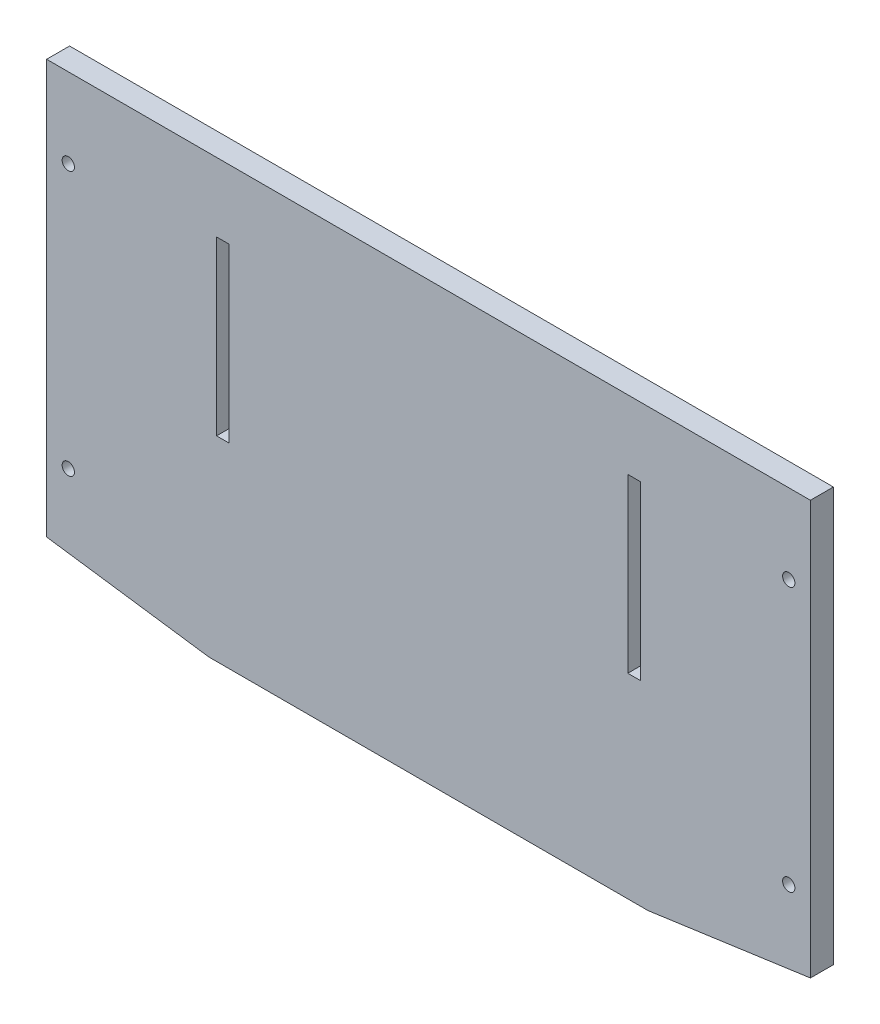
ISO-10303-21;
HEADER;
FILE_DESCRIPTION(('STEP AP214'),'2;1');
FILE_NAME('part.step','',(''),(''),'','','');
FILE_SCHEMA(('AUTOMOTIVE_DESIGN { 1 0 10303 214 1 1 1 1 }'));
ENDSEC;
DATA;
#1=APPLICATION_CONTEXT('core data for automotive mechanical design processes');
#2=APPLICATION_PROTOCOL_DEFINITION('international standard','automotive_design',2000,#1);
#3=PRODUCT_CONTEXT('',#1,'mechanical');
#4=PRODUCT('Part','Part','',(#3));
#5=PRODUCT_RELATED_PRODUCT_CATEGORY('part','',(#4));
#6=PRODUCT_DEFINITION_FORMATION('','',#4);
#7=PRODUCT_DEFINITION_CONTEXT('part definition',#1,'design');
#8=PRODUCT_DEFINITION('design','',#6,#7);
#9=PRODUCT_DEFINITION_SHAPE('','',#8);
#10=(LENGTH_UNIT() NAMED_UNIT(*) SI_UNIT(.MILLI.,.METRE.));
#11=(NAMED_UNIT(*) PLANE_ANGLE_UNIT() SI_UNIT($,.RADIAN.));
#12=(NAMED_UNIT(*) SI_UNIT($,.STERADIAN.) SOLID_ANGLE_UNIT());
#13=UNCERTAINTY_MEASURE_WITH_UNIT(LENGTH_MEASURE(1.E-05),#10,'distance_accuracy_value','');
#14=(GEOMETRIC_REPRESENTATION_CONTEXT(3) GLOBAL_UNCERTAINTY_ASSIGNED_CONTEXT((#13)) GLOBAL_UNIT_ASSIGNED_CONTEXT((#10,
#11,#12)) REPRESENTATION_CONTEXT('',''));
#15=CARTESIAN_POINT('',(0.,0.,0.));
#16=DIRECTION('',(0.,0.,1.));
#17=DIRECTION('',(1.,0.,0.));
#18=AXIS2_PLACEMENT_3D('',#15,#16,#17);
#19=CARTESIAN_POINT('',(0.,127.,6.35));
#20=DIRECTION('',(1.,0.,0.));
#21=DIRECTION('',(0.,1.,0.));
#22=AXIS2_PLACEMENT_3D('',#19,#20,#21);
#23=PLANE('',#22);
#24=DIRECTION('',(0.,-1.,0.));
#25=VECTOR('',#24,1.);
#26=CARTESIAN_POINT('',(0.,127.,0.));
#27=LINE('',#26,#25);
#28=CARTESIAN_POINT('',(0.,127.,0.));
#29=VERTEX_POINT('',#28);
#30=CARTESIAN_POINT('',(0.,12.6083117954881,0.));
#31=VERTEX_POINT('',#30);
#32=EDGE_CURVE('E297',#29,#31,#27,.T.);
#33=ORIENTED_EDGE('',*,*,#32,.T.);
#34=DIRECTION('',(0.,0.,1.));
#35=VECTOR('',#34,1.);
#36=CARTESIAN_POINT('',(0.,12.6083117954881,0.));
#37=LINE('',#36,#35);
#38=CARTESIAN_POINT('',(0.,12.6083117954881,6.35));
#39=VERTEX_POINT('',#38);
#40=EDGE_CURVE('E174',#31,#39,#37,.T.);
#41=ORIENTED_EDGE('',*,*,#40,.T.);
#42=DIRECTION('',(0.,-1.,0.));
#43=VECTOR('',#42,1.);
#44=CARTESIAN_POINT('',(0.,127.,6.35));
#45=LINE('',#44,#43);
#46=CARTESIAN_POINT('',(0.,127.,6.35));
#47=VERTEX_POINT('',#46);
#48=EDGE_CURVE('E298',#47,#39,#45,.T.);
#49=ORIENTED_EDGE('',*,*,#48,.F.);
#50=DIRECTION('',(0.,0.,-1.));
#51=VECTOR('',#50,1.);
#52=CARTESIAN_POINT('',(0.,127.,6.35));
#53=LINE('',#52,#51);
#54=EDGE_CURVE('E51',#47,#29,#53,.T.);
#55=ORIENTED_EDGE('',*,*,#54,.T.);
#56=EDGE_LOOP('',(#33,#41,#49,#55));
#57=FACE_BOUND('',#56,.T.);
#58=ADVANCED_FACE('F43',(#57),#23,.F.);
#59=CARTESIAN_POINT('',(211.1756,127.,6.35));
#60=DIRECTION('',(-1.,0.,0.));
#61=DIRECTION('',(0.,-1.,0.));
#62=AXIS2_PLACEMENT_3D('',#59,#60,#61);
#63=PLANE('',#62);
#64=DIRECTION('',(0.,1.,0.));
#65=VECTOR('',#64,1.);
#66=CARTESIAN_POINT('',(211.1756,127.,6.35));
#67=LINE('',#66,#65);
#68=CARTESIAN_POINT('',(211.1756,12.6083117954881,6.35));
#69=VERTEX_POINT('',#68);
#70=CARTESIAN_POINT('',(211.1756,127.,6.35));
#71=VERTEX_POINT('',#70);
#72=EDGE_CURVE('E302',#69,#71,#67,.T.);
#73=ORIENTED_EDGE('',*,*,#72,.F.);
#74=DIRECTION('',(0.,0.,1.));
#75=VECTOR('',#74,1.);
#76=CARTESIAN_POINT('',(211.1756,12.6083117954881,0.));
#77=LINE('',#76,#75);
#78=CARTESIAN_POINT('',(211.1756,12.6083117954881,0.));
#79=VERTEX_POINT('',#78);
#80=EDGE_CURVE('E166',#79,#69,#77,.T.);
#81=ORIENTED_EDGE('',*,*,#80,.F.);
#82=DIRECTION('',(0.,1.,0.));
#83=VECTOR('',#82,1.);
#84=CARTESIAN_POINT('',(211.1756,127.,0.));
#85=LINE('',#84,#83);
#86=CARTESIAN_POINT('',(211.1756,127.,0.));
#87=VERTEX_POINT('',#86);
#88=EDGE_CURVE('E164',#79,#87,#85,.T.);
#89=ORIENTED_EDGE('',*,*,#88,.T.);
#90=DIRECTION('',(0.,0.,-1.));
#91=VECTOR('',#90,1.);
#92=CARTESIAN_POINT('',(211.1756,127.,6.35));
#93=LINE('',#92,#91);
#94=EDGE_CURVE('E11',#71,#87,#93,.T.);
#95=ORIENTED_EDGE('',*,*,#94,.F.);
#96=EDGE_LOOP('',(#73,#81,#89,#95));
#97=FACE_BOUND('',#96,.T.);
#98=ADVANCED_FACE('F327',(#97),#63,.F.);
#99=CARTESIAN_POINT('',(211.1756,127.,6.35));
#100=DIRECTION('',(0.,-1.,0.));
#101=DIRECTION('',(1.,0.,0.));
#102=AXIS2_PLACEMENT_3D('',#99,#100,#101);
#103=PLANE('',#102);
#104=DIRECTION('',(-1.,0.,0.));
#105=VECTOR('',#104,1.);
#106=CARTESIAN_POINT('',(211.1756,127.,0.));
#107=LINE('',#106,#105);
#108=EDGE_CURVE('E303',#87,#29,#107,.T.);
#109=ORIENTED_EDGE('',*,*,#108,.T.);
#110=ORIENTED_EDGE('',*,*,#54,.F.);
#111=DIRECTION('',(-1.,0.,0.));
#112=VECTOR('',#111,1.);
#113=CARTESIAN_POINT('',(211.1756,127.,6.35));
#114=LINE('',#113,#112);
#115=EDGE_CURVE('E306',#71,#47,#114,.T.);
#116=ORIENTED_EDGE('',*,*,#115,.F.);
#117=ORIENTED_EDGE('',*,*,#94,.T.);
#118=EDGE_LOOP('',(#109,#110,#116,#117));
#119=FACE_BOUND('',#118,.T.);
#120=ADVANCED_FACE('F323',(#119),#103,.F.);
#121=CARTESIAN_POINT('',(0.,0.,6.35));
#122=DIRECTION('',(0.,0.,-1.));
#123=DIRECTION('',(-1.,0.,0.));
#124=AXIS2_PLACEMENT_3D('',#121,#122,#123);
#125=PLANE('',#124);
#126=DIRECTION('',(1.,0.,0.));
#127=VECTOR('',#126,1.);
#128=CARTESIAN_POINT('',(46.99,60.325,6.35));
#129=LINE('',#128,#127);
#130=CARTESIAN_POINT('',(46.99,60.325,6.35));
#131=VERTEX_POINT('',#130);
#132=CARTESIAN_POINT('',(50.4952,60.325,6.35));
#133=VERTEX_POINT('',#132);
#134=EDGE_CURVE('E198',#131,#133,#129,.T.);
#135=ORIENTED_EDGE('',*,*,#134,.F.);
#136=DIRECTION('',(0.,-1.,0.));
#137=VECTOR('',#136,1.);
#138=CARTESIAN_POINT('',(46.99,107.95,6.35));
#139=LINE('',#138,#137);
#140=CARTESIAN_POINT('',(46.99,107.95,6.35));
#141=VERTEX_POINT('',#140);
#142=EDGE_CURVE('E195',#141,#131,#139,.T.);
#143=ORIENTED_EDGE('',*,*,#142,.F.);
#144=DIRECTION('',(-1.,0.,0.));
#145=VECTOR('',#144,1.);
#146=CARTESIAN_POINT('',(46.99,107.95,6.35));
#147=LINE('',#146,#145);
#148=CARTESIAN_POINT('',(50.4952,107.95,6.35));
#149=VERTEX_POINT('',#148);
#150=EDGE_CURVE('E182',#149,#141,#147,.T.);
#151=ORIENTED_EDGE('',*,*,#150,.F.);
#152=DIRECTION('',(0.,1.,0.));
#153=VECTOR('',#152,1.);
#154=CARTESIAN_POINT('',(50.4952,107.95,6.35));
#155=LINE('',#154,#153);
#156=EDGE_CURVE('E203',#133,#149,#155,.T.);
#157=ORIENTED_EDGE('',*,*,#156,.F.);
#158=EDGE_LOOP('',(#135,#143,#151,#157));
#159=FACE_BOUND('',#158,.T.);
#160=DIRECTION('',(1.,0.,0.));
#161=VECTOR('',#160,1.);
#162=CARTESIAN_POINT('',(160.6804,60.325,6.35));
#163=LINE('',#162,#161);
#164=CARTESIAN_POINT('',(160.6804,60.325,6.35));
#165=VERTEX_POINT('',#164);
#166=CARTESIAN_POINT('',(164.1856,60.325,6.35));
#167=VERTEX_POINT('',#166);
#168=EDGE_CURVE('E244',#165,#167,#163,.T.);
#169=ORIENTED_EDGE('',*,*,#168,.F.);
#170=DIRECTION('',(0.,-1.,0.));
#171=VECTOR('',#170,1.);
#172=CARTESIAN_POINT('',(160.6804,107.95,6.35));
#173=LINE('',#172,#171);
#174=CARTESIAN_POINT('',(160.6804,107.95,6.35));
#175=VERTEX_POINT('',#174);
#176=EDGE_CURVE('E241',#175,#165,#173,.T.);
#177=ORIENTED_EDGE('',*,*,#176,.F.);
#178=DIRECTION('',(-1.,0.,0.));
#179=VECTOR('',#178,1.);
#180=CARTESIAN_POINT('',(160.6804,107.95,6.35));
#181=LINE('',#180,#179);
#182=CARTESIAN_POINT('',(164.1856,107.95,6.35));
#183=VERTEX_POINT('',#182);
#184=EDGE_CURVE('E228',#183,#175,#181,.T.);
#185=ORIENTED_EDGE('',*,*,#184,.F.);
#186=DIRECTION('',(0.,1.,0.));
#187=VECTOR('',#186,1.);
#188=CARTESIAN_POINT('',(164.1856,107.95,6.35));
#189=LINE('',#188,#187);
#190=EDGE_CURVE('E248',#167,#183,#189,.T.);
#191=ORIENTED_EDGE('',*,*,#190,.F.);
#192=EDGE_LOOP('',(#169,#177,#185,#191));
#193=FACE_BOUND('',#192,.T.);
#194=CARTESIAN_POINT('',(5.99440000000001,105.0036,6.35));
#195=DIRECTION('',(0.,0.,1.));
#196=DIRECTION('',(1.,0.,0.));
#197=AXIS2_PLACEMENT_3D('',#194,#195,#196);
#198=CIRCLE('',#197,1.7);
#199=CARTESIAN_POINT('',(7.69440000000001,105.0036,6.35));
#200=VERTEX_POINT('',#199);
#201=EDGE_CURVE('E213',#200,#200,#198,.T.);
#202=ORIENTED_EDGE('',*,*,#201,.F.);
#203=EDGE_LOOP('',(#202));
#204=FACE_BOUND('',#203,.T.);
#205=CARTESIAN_POINT('',(5.99440000000001,31.9786,6.35));
#206=DIRECTION('',(0.,0.,1.));
#207=DIRECTION('',(1.,0.,0.));
#208=AXIS2_PLACEMENT_3D('',#205,#206,#207);
#209=CIRCLE('',#208,1.7);
#210=CARTESIAN_POINT('',(7.69440000000001,31.9786,6.35));
#211=VERTEX_POINT('',#210);
#212=EDGE_CURVE('E273',#211,#211,#209,.T.);
#213=ORIENTED_EDGE('',*,*,#212,.F.);
#214=EDGE_LOOP('',(#213));
#215=FACE_BOUND('',#214,.T.);
#216=CARTESIAN_POINT('',(205.1812,31.9786,6.35));
#217=DIRECTION('',(0.,0.,1.));
#218=DIRECTION('',(1.,0.,0.));
#219=AXIS2_PLACEMENT_3D('',#216,#217,#218);
#220=CIRCLE('',#219,1.70000000000001);
#221=CARTESIAN_POINT('',(206.8812,31.9786,6.35));
#222=VERTEX_POINT('',#221);
#223=EDGE_CURVE('E281',#222,#222,#220,.T.);
#224=ORIENTED_EDGE('',*,*,#223,.F.);
#225=EDGE_LOOP('',(#224));
#226=FACE_BOUND('',#225,.T.);
#227=CARTESIAN_POINT('',(205.1812,105.0036,6.35));
#228=DIRECTION('',(0.,0.,1.));
#229=DIRECTION('',(1.,0.,0.));
#230=AXIS2_PLACEMENT_3D('',#227,#228,#229);
#231=CIRCLE('',#230,1.70000000000001);
#232=CARTESIAN_POINT('',(206.8812,105.0036,6.35));
#233=VERTEX_POINT('',#232);
#234=EDGE_CURVE('E289',#233,#233,#231,.T.);
#235=ORIENTED_EDGE('',*,*,#234,.F.);
#236=EDGE_LOOP('',(#235));
#237=FACE_BOUND('',#236,.T.);
#238=DIRECTION('',(-0.990268068741571,0.139173100960058,0.));
#239=VECTOR('',#238,1.);
#240=CARTESIAN_POINT('',(0.,12.6083117954881,6.35));
#241=LINE('',#240,#239);
#242=CARTESIAN_POINT('',(44.8563999999999,6.30415589774405,6.35));
#243=VERTEX_POINT('',#242);
#244=EDGE_CURVE('E170',#243,#39,#241,.T.);
#245=ORIENTED_EDGE('',*,*,#244,.F.);
#246=DIRECTION('',(-1.,0.,0.));
#247=VECTOR('',#246,1.);
#248=CARTESIAN_POINT('',(44.8563999999999,6.30415589774405,6.35));
#249=LINE('',#248,#247);
#250=CARTESIAN_POINT('',(166.3192,6.30415589774404,6.35));
#251=VERTEX_POINT('',#250);
#252=EDGE_CURVE('E58',#251,#243,#249,.T.);
#253=ORIENTED_EDGE('',*,*,#252,.F.);
#254=DIRECTION('',(-0.990268068741571,-0.139173100960059,0.));
#255=VECTOR('',#254,1.);
#256=CARTESIAN_POINT('',(211.1756,12.6083117954881,6.35));
#257=LINE('',#256,#255);
#258=EDGE_CURVE('E157',#69,#251,#257,.T.);
#259=ORIENTED_EDGE('',*,*,#258,.F.);
#260=ORIENTED_EDGE('',*,*,#72,.T.);
#261=ORIENTED_EDGE('',*,*,#115,.T.);
#262=ORIENTED_EDGE('',*,*,#48,.T.);
#263=EDGE_LOOP('',(#245,#253,#259,#260,#261,#262));
#264=FACE_BOUND('',#263,.T.);
#265=ADVANCED_FACE('F330',(#159,#193,#204,#215,#226,#237,#264),#125,.F.);
#266=CARTESIAN_POINT('',(0.,0.,0.));
#267=DIRECTION('',(0.,0.,-1.));
#268=DIRECTION('',(-1.,0.,0.));
#269=AXIS2_PLACEMENT_3D('',#266,#267,#268);
#270=PLANE('',#269);
#271=DIRECTION('',(-1.,0.,0.));
#272=VECTOR('',#271,1.);
#273=CARTESIAN_POINT('',(44.8563999999999,6.30415589774405,0.));
#274=LINE('',#273,#272);
#275=CARTESIAN_POINT('',(166.3192,6.30415589774404,0.));
#276=VERTEX_POINT('',#275);
#277=CARTESIAN_POINT('',(44.8563999999999,6.30415589774405,0.));
#278=VERTEX_POINT('',#277);
#279=EDGE_CURVE('E143',#276,#278,#274,.T.);
#280=ORIENTED_EDGE('',*,*,#279,.T.);
#281=DIRECTION('',(-0.990268068741571,0.139173100960058,0.));
#282=VECTOR('',#281,1.);
#283=CARTESIAN_POINT('',(0.,12.6083117954881,0.));
#284=LINE('',#283,#282);
#285=EDGE_CURVE('E66',#278,#31,#284,.T.);
#286=ORIENTED_EDGE('',*,*,#285,.T.);
#287=ORIENTED_EDGE('',*,*,#32,.F.);
#288=ORIENTED_EDGE('',*,*,#108,.F.);
#289=ORIENTED_EDGE('',*,*,#88,.F.);
#290=DIRECTION('',(-0.990268068741571,-0.139173100960059,0.));
#291=VECTOR('',#290,1.);
#292=CARTESIAN_POINT('',(211.1756,12.6083117954881,0.));
#293=LINE('',#292,#291);
#294=EDGE_CURVE('E154',#79,#276,#293,.T.);
#295=ORIENTED_EDGE('',*,*,#294,.T.);
#296=EDGE_LOOP('',(#280,#286,#287,#288,#289,#295));
#297=FACE_BOUND('',#296,.T.);
#298=DIRECTION('',(0.,-1.,0.));
#299=VECTOR('',#298,1.);
#300=CARTESIAN_POINT('',(46.99,107.95,0.));
#301=LINE('',#300,#299);
#302=CARTESIAN_POINT('',(46.99,107.95,0.));
#303=VERTEX_POINT('',#302);
#304=CARTESIAN_POINT('',(46.99,60.325,0.));
#305=VERTEX_POINT('',#304);
#306=EDGE_CURVE('E177',#303,#305,#301,.T.);
#307=ORIENTED_EDGE('',*,*,#306,.T.);
#308=DIRECTION('',(1.,0.,0.));
#309=VECTOR('',#308,1.);
#310=CARTESIAN_POINT('',(46.99,60.325,0.));
#311=LINE('',#310,#309);
#312=CARTESIAN_POINT('',(50.4952,60.325,0.));
#313=VERTEX_POINT('',#312);
#314=EDGE_CURVE('E181',#305,#313,#311,.T.);
#315=ORIENTED_EDGE('',*,*,#314,.T.);
#316=DIRECTION('',(0.,1.,0.));
#317=VECTOR('',#316,1.);
#318=CARTESIAN_POINT('',(50.4952,107.95,0.));
#319=LINE('',#318,#317);
#320=CARTESIAN_POINT('',(50.4952,107.95,0.));
#321=VERTEX_POINT('',#320);
#322=EDGE_CURVE('E186',#313,#321,#319,.T.);
#323=ORIENTED_EDGE('',*,*,#322,.T.);
#324=DIRECTION('',(-1.,0.,0.));
#325=VECTOR('',#324,1.);
#326=CARTESIAN_POINT('',(46.99,107.95,0.));
#327=LINE('',#326,#325);
#328=EDGE_CURVE('E190',#321,#303,#327,.T.);
#329=ORIENTED_EDGE('',*,*,#328,.T.);
#330=EDGE_LOOP('',(#307,#315,#323,#329));
#331=FACE_BOUND('',#330,.T.);
#332=DIRECTION('',(0.,-1.,0.));
#333=VECTOR('',#332,1.);
#334=CARTESIAN_POINT('',(160.6804,107.95,0.));
#335=LINE('',#334,#333);
#336=CARTESIAN_POINT('',(160.6804,107.95,0.));
#337=VERTEX_POINT('',#336);
#338=CARTESIAN_POINT('',(160.6804,60.325,0.));
#339=VERTEX_POINT('',#338);
#340=EDGE_CURVE('E223',#337,#339,#335,.T.);
#341=ORIENTED_EDGE('',*,*,#340,.T.);
#342=DIRECTION('',(1.,0.,0.));
#343=VECTOR('',#342,1.);
#344=CARTESIAN_POINT('',(160.6804,60.325,0.));
#345=LINE('',#344,#343);
#346=CARTESIAN_POINT('',(164.1856,60.325,0.));
#347=VERTEX_POINT('',#346);
#348=EDGE_CURVE('E227',#339,#347,#345,.T.);
#349=ORIENTED_EDGE('',*,*,#348,.T.);
#350=DIRECTION('',(0.,1.,0.));
#351=VECTOR('',#350,1.);
#352=CARTESIAN_POINT('',(164.1856,107.95,0.));
#353=LINE('',#352,#351);
#354=CARTESIAN_POINT('',(164.1856,107.95,0.));
#355=VERTEX_POINT('',#354);
#356=EDGE_CURVE('E232',#347,#355,#353,.T.);
#357=ORIENTED_EDGE('',*,*,#356,.T.);
#358=DIRECTION('',(-1.,0.,0.));
#359=VECTOR('',#358,1.);
#360=CARTESIAN_POINT('',(160.6804,107.95,0.));
#361=LINE('',#360,#359);
#362=EDGE_CURVE('E236',#355,#337,#361,.T.);
#363=ORIENTED_EDGE('',*,*,#362,.T.);
#364=EDGE_LOOP('',(#341,#349,#357,#363));
#365=FACE_BOUND('',#364,.T.);
#366=CARTESIAN_POINT('',(5.99440000000001,105.0036,0.));
#367=DIRECTION('',(0.,0.,1.));
#368=DIRECTION('',(1.,0.,0.));
#369=AXIS2_PLACEMENT_3D('',#366,#367,#368);
#370=CIRCLE('',#369,1.7);
#371=CARTESIAN_POINT('',(7.69440000000001,105.0036,0.));
#372=VERTEX_POINT('',#371);
#373=EDGE_CURVE('E269',#372,#372,#370,.T.);
#374=ORIENTED_EDGE('',*,*,#373,.T.);
#375=EDGE_LOOP('',(#374));
#376=FACE_BOUND('',#375,.T.);
#377=CARTESIAN_POINT('',(5.99440000000001,31.9786,0.));
#378=DIRECTION('',(0.,0.,1.));
#379=DIRECTION('',(1.,0.,0.));
#380=AXIS2_PLACEMENT_3D('',#377,#378,#379);
#381=CIRCLE('',#380,1.7);
#382=CARTESIAN_POINT('',(7.69440000000001,31.9786,0.));
#383=VERTEX_POINT('',#382);
#384=EDGE_CURVE('E277',#383,#383,#381,.T.);
#385=ORIENTED_EDGE('',*,*,#384,.T.);
#386=EDGE_LOOP('',(#385));
#387=FACE_BOUND('',#386,.T.);
#388=CARTESIAN_POINT('',(205.1812,31.9786,0.));
#389=DIRECTION('',(0.,0.,1.));
#390=DIRECTION('',(1.,0.,0.));
#391=AXIS2_PLACEMENT_3D('',#388,#389,#390);
#392=CIRCLE('',#391,1.70000000000001);
#393=CARTESIAN_POINT('',(206.8812,31.9786,0.));
#394=VERTEX_POINT('',#393);
#395=EDGE_CURVE('E285',#394,#394,#392,.T.);
#396=ORIENTED_EDGE('',*,*,#395,.T.);
#397=EDGE_LOOP('',(#396));
#398=FACE_BOUND('',#397,.T.);
#399=CARTESIAN_POINT('',(205.1812,105.0036,0.));
#400=DIRECTION('',(0.,0.,1.));
#401=DIRECTION('',(1.,0.,0.));
#402=AXIS2_PLACEMENT_3D('',#399,#400,#401);
#403=CIRCLE('',#402,1.70000000000001);
#404=CARTESIAN_POINT('',(206.8812,105.0036,0.));
#405=VERTEX_POINT('',#404);
#406=EDGE_CURVE('E293',#405,#405,#403,.T.);
#407=ORIENTED_EDGE('',*,*,#406,.T.);
#408=EDGE_LOOP('',(#407));
#409=FACE_BOUND('',#408,.T.);
#410=ADVANCED_FACE('F161',(#297,#331,#365,#376,#387,#398,#409),#270,.T.);
#411=CARTESIAN_POINT('',(205.1812,105.0036,6.35));
#412=DIRECTION('',(0.,0.,1.));
#413=DIRECTION('',(1.,0.,0.));
#414=AXIS2_PLACEMENT_3D('',#411,#412,#413);
#415=CYLINDRICAL_SURFACE('',#414,1.70000000000001);
#416=ORIENTED_EDGE('',*,*,#406,.F.);
#417=EDGE_LOOP('',(#416));
#418=FACE_BOUND('',#417,.T.);
#419=ORIENTED_EDGE('',*,*,#234,.T.);
#420=EDGE_LOOP('',(#419));
#421=FACE_BOUND('',#420,.T.);
#422=ADVANCED_FACE('F361',(#418,#421),#415,.F.);
#423=CARTESIAN_POINT('',(205.1812,31.9786,6.35));
#424=DIRECTION('',(0.,0.,1.));
#425=DIRECTION('',(1.,0.,0.));
#426=AXIS2_PLACEMENT_3D('',#423,#424,#425);
#427=CYLINDRICAL_SURFACE('',#426,1.70000000000001);
#428=ORIENTED_EDGE('',*,*,#395,.F.);
#429=EDGE_LOOP('',(#428));
#430=FACE_BOUND('',#429,.T.);
#431=ORIENTED_EDGE('',*,*,#223,.T.);
#432=EDGE_LOOP('',(#431));
#433=FACE_BOUND('',#432,.T.);
#434=ADVANCED_FACE('F367',(#430,#433),#427,.F.);
#435=CARTESIAN_POINT('',(5.99440000000001,31.9786,6.35));
#436=DIRECTION('',(0.,0.,1.));
#437=DIRECTION('',(1.,0.,0.));
#438=AXIS2_PLACEMENT_3D('',#435,#436,#437);
#439=CYLINDRICAL_SURFACE('',#438,1.7);
#440=ORIENTED_EDGE('',*,*,#384,.F.);
#441=EDGE_LOOP('',(#440));
#442=FACE_BOUND('',#441,.T.);
#443=ORIENTED_EDGE('',*,*,#212,.T.);
#444=EDGE_LOOP('',(#443));
#445=FACE_BOUND('',#444,.T.);
#446=ADVANCED_FACE('F371',(#442,#445),#439,.F.);
#447=CARTESIAN_POINT('',(5.99440000000001,105.0036,6.35));
#448=DIRECTION('',(0.,0.,1.));
#449=DIRECTION('',(1.,0.,0.));
#450=AXIS2_PLACEMENT_3D('',#447,#448,#449);
#451=CYLINDRICAL_SURFACE('',#450,1.7);
#452=ORIENTED_EDGE('',*,*,#373,.F.);
#453=EDGE_LOOP('',(#452));
#454=FACE_BOUND('',#453,.T.);
#455=ORIENTED_EDGE('',*,*,#201,.T.);
#456=EDGE_LOOP('',(#455));
#457=FACE_BOUND('',#456,.T.);
#458=ADVANCED_FACE('F375',(#454,#457),#451,.F.);
#459=CARTESIAN_POINT('',(160.6804,107.95,0.));
#460=DIRECTION('',(-1.,0.,0.));
#461=DIRECTION('',(0.,0.,1.));
#462=AXIS2_PLACEMENT_3D('',#459,#460,#461);
#463=PLANE('',#462);
#464=ORIENTED_EDGE('',*,*,#176,.T.);
#465=DIRECTION('',(0.,0.,1.));
#466=VECTOR('',#465,1.);
#467=CARTESIAN_POINT('',(160.6804,60.325,0.));
#468=LINE('',#467,#466);
#469=EDGE_CURVE('E240',#339,#165,#468,.T.);
#470=ORIENTED_EDGE('',*,*,#469,.F.);
#471=ORIENTED_EDGE('',*,*,#340,.F.);
#472=DIRECTION('',(0.,0.,1.));
#473=VECTOR('',#472,1.);
#474=CARTESIAN_POINT('',(160.6804,107.95,0.));
#475=LINE('',#474,#473);
#476=EDGE_CURVE('E199',#337,#175,#475,.T.);
#477=ORIENTED_EDGE('',*,*,#476,.T.);
#478=EDGE_LOOP('',(#464,#470,#471,#477));
#479=FACE_BOUND('',#478,.T.);
#480=ADVANCED_FACE('F379',(#479),#463,.F.);
#481=CARTESIAN_POINT('',(160.6804,107.95,0.));
#482=DIRECTION('',(0.,1.,0.));
#483=DIRECTION('',(-1.,0.,0.));
#484=AXIS2_PLACEMENT_3D('',#481,#482,#483);
#485=PLANE('',#484);
#486=ORIENTED_EDGE('',*,*,#184,.T.);
#487=ORIENTED_EDGE('',*,*,#476,.F.);
#488=ORIENTED_EDGE('',*,*,#362,.F.);
#489=DIRECTION('',(0.,0.,1.));
#490=VECTOR('',#489,1.);
#491=CARTESIAN_POINT('',(164.1856,107.95,0.));
#492=LINE('',#491,#490);
#493=EDGE_CURVE('E257',#355,#183,#492,.T.);
#494=ORIENTED_EDGE('',*,*,#493,.T.);
#495=EDGE_LOOP('',(#486,#487,#488,#494));
#496=FACE_BOUND('',#495,.T.);
#497=ADVANCED_FACE('F383',(#496),#485,.F.);
#498=CARTESIAN_POINT('',(164.1856,107.95,0.));
#499=DIRECTION('',(1.,0.,0.));
#500=DIRECTION('',(0.,1.,0.));
#501=AXIS2_PLACEMENT_3D('',#498,#499,#500);
#502=PLANE('',#501);
#503=ORIENTED_EDGE('',*,*,#190,.T.);
#504=ORIENTED_EDGE('',*,*,#493,.F.);
#505=ORIENTED_EDGE('',*,*,#356,.F.);
#506=DIRECTION('',(0.,0.,1.));
#507=VECTOR('',#506,1.);
#508=CARTESIAN_POINT('',(164.1856,60.325,0.));
#509=LINE('',#508,#507);
#510=EDGE_CURVE('E260',#347,#167,#509,.T.);
#511=ORIENTED_EDGE('',*,*,#510,.T.);
#512=EDGE_LOOP('',(#503,#504,#505,#511));
#513=FACE_BOUND('',#512,.T.);
#514=ADVANCED_FACE('F389',(#513),#502,.F.);
#515=CARTESIAN_POINT('',(160.6804,60.325,0.));
#516=DIRECTION('',(0.,-1.,0.));
#517=DIRECTION('',(0.,0.,-1.));
#518=AXIS2_PLACEMENT_3D('',#515,#516,#517);
#519=PLANE('',#518);
#520=ORIENTED_EDGE('',*,*,#168,.T.);
#521=ORIENTED_EDGE('',*,*,#510,.F.);
#522=ORIENTED_EDGE('',*,*,#348,.F.);
#523=ORIENTED_EDGE('',*,*,#469,.T.);
#524=EDGE_LOOP('',(#520,#521,#522,#523));
#525=FACE_BOUND('',#524,.T.);
#526=ADVANCED_FACE('F385',(#525),#519,.F.);
#527=CARTESIAN_POINT('',(46.99,107.95,0.));
#528=DIRECTION('',(-1.,0.,0.));
#529=DIRECTION('',(0.,-1.,0.));
#530=AXIS2_PLACEMENT_3D('',#527,#528,#529);
#531=PLANE('',#530);
#532=ORIENTED_EDGE('',*,*,#142,.T.);
#533=DIRECTION('',(0.,0.,1.));
#534=VECTOR('',#533,1.);
#535=CARTESIAN_POINT('',(46.99,60.325,0.));
#536=LINE('',#535,#534);
#537=EDGE_CURVE('E194',#305,#131,#536,.T.);
#538=ORIENTED_EDGE('',*,*,#537,.F.);
#539=ORIENTED_EDGE('',*,*,#306,.F.);
#540=DIRECTION('',(0.,0.,1.));
#541=VECTOR('',#540,1.);
#542=CARTESIAN_POINT('',(46.99,107.95,0.));
#543=LINE('',#542,#541);
#544=EDGE_CURVE('E210',#303,#141,#543,.T.);
#545=ORIENTED_EDGE('',*,*,#544,.T.);
#546=EDGE_LOOP('',(#532,#538,#539,#545));
#547=FACE_BOUND('',#546,.T.);
#548=ADVANCED_FACE('F388',(#547),#531,.F.);
#549=CARTESIAN_POINT('',(46.99,107.95,0.));
#550=DIRECTION('',(0.,1.,0.));
#551=DIRECTION('',(-1.,0.,0.));
#552=AXIS2_PLACEMENT_3D('',#549,#550,#551);
#553=PLANE('',#552);
#554=ORIENTED_EDGE('',*,*,#150,.T.);
#555=ORIENTED_EDGE('',*,*,#544,.F.);
#556=ORIENTED_EDGE('',*,*,#328,.F.);
#557=DIRECTION('',(0.,0.,1.));
#558=VECTOR('',#557,1.);
#559=CARTESIAN_POINT('',(50.4952,107.95,0.));
#560=LINE('',#559,#558);
#561=EDGE_CURVE('E214',#321,#149,#560,.T.);
#562=ORIENTED_EDGE('',*,*,#561,.T.);
#563=EDGE_LOOP('',(#554,#555,#556,#562));
#564=FACE_BOUND('',#563,.T.);
#565=ADVANCED_FACE('F399',(#564),#553,.F.);
#566=CARTESIAN_POINT('',(50.4952,107.95,0.));
#567=DIRECTION('',(1.,0.,0.));
#568=DIRECTION('',(0.,0.,-1.));
#569=AXIS2_PLACEMENT_3D('',#566,#567,#568);
#570=PLANE('',#569);
#571=ORIENTED_EDGE('',*,*,#156,.T.);
#572=ORIENTED_EDGE('',*,*,#561,.F.);
#573=ORIENTED_EDGE('',*,*,#322,.F.);
#574=DIRECTION('',(0.,0.,1.));
#575=VECTOR('',#574,1.);
#576=CARTESIAN_POINT('',(50.4952,60.325,0.));
#577=LINE('',#576,#575);
#578=EDGE_CURVE('E217',#313,#133,#577,.T.);
#579=ORIENTED_EDGE('',*,*,#578,.T.);
#580=EDGE_LOOP('',(#571,#572,#573,#579));
#581=FACE_BOUND('',#580,.T.);
#582=ADVANCED_FACE('F403',(#581),#570,.F.);
#583=CARTESIAN_POINT('',(46.99,60.325,0.));
#584=DIRECTION('',(0.,-1.,0.));
#585=DIRECTION('',(0.,0.,-1.));
#586=AXIS2_PLACEMENT_3D('',#583,#584,#585);
#587=PLANE('',#586);
#588=ORIENTED_EDGE('',*,*,#134,.T.);
#589=ORIENTED_EDGE('',*,*,#578,.F.);
#590=ORIENTED_EDGE('',*,*,#314,.F.);
#591=ORIENTED_EDGE('',*,*,#537,.T.);
#592=EDGE_LOOP('',(#588,#589,#590,#591));
#593=FACE_BOUND('',#592,.T.);
#594=ADVANCED_FACE('F348',(#593),#587,.F.);
#595=CARTESIAN_POINT('',(211.1756,12.6083117954881,0.));
#596=DIRECTION('',(-0.139173100960059,0.990268068741571,0.));
#597=DIRECTION('',(-0.990268068741571,-0.139173100960059,0.));
#598=AXIS2_PLACEMENT_3D('',#595,#596,#597);
#599=PLANE('',#598);
#600=ORIENTED_EDGE('',*,*,#258,.T.);
#601=DIRECTION('',(0.,0.,1.));
#602=VECTOR('',#601,1.);
#603=CARTESIAN_POINT('',(166.3192,6.30415589774404,0.));
#604=LINE('',#603,#602);
#605=EDGE_CURVE('E146',#276,#251,#604,.T.);
#606=ORIENTED_EDGE('',*,*,#605,.F.);
#607=ORIENTED_EDGE('',*,*,#294,.F.);
#608=ORIENTED_EDGE('',*,*,#80,.T.);
#609=EDGE_LOOP('',(#600,#606,#607,#608));
#610=FACE_BOUND('',#609,.T.);
#611=ADVANCED_FACE('F153',(#610),#599,.F.);
#612=CARTESIAN_POINT('',(0.,12.6083117954881,0.));
#613=DIRECTION('',(0.139173100960058,0.990268068741571,0.));
#614=DIRECTION('',(-0.990268068741571,0.139173100960058,0.));
#615=AXIS2_PLACEMENT_3D('',#612,#613,#614);
#616=PLANE('',#615);
#617=ORIENTED_EDGE('',*,*,#285,.F.);
#618=DIRECTION('',(0.,0.,1.));
#619=VECTOR('',#618,1.);
#620=CARTESIAN_POINT('',(44.8563999999999,6.30415589774405,0.));
#621=LINE('',#620,#619);
#622=EDGE_CURVE('E147',#278,#243,#621,.T.);
#623=ORIENTED_EDGE('',*,*,#622,.T.);
#624=ORIENTED_EDGE('',*,*,#244,.T.);
#625=ORIENTED_EDGE('',*,*,#40,.F.);
#626=EDGE_LOOP('',(#617,#623,#624,#625));
#627=FACE_BOUND('',#626,.T.);
#628=ADVANCED_FACE('F339',(#627),#616,.F.);
#629=CARTESIAN_POINT('',(44.8563999999999,6.30415589774405,0.));
#630=DIRECTION('',(0.,1.,0.));
#631=DIRECTION('',(-1.,0.,0.));
#632=AXIS2_PLACEMENT_3D('',#629,#630,#631);
#633=PLANE('',#632);
#634=ORIENTED_EDGE('',*,*,#252,.T.);
#635=ORIENTED_EDGE('',*,*,#622,.F.);
#636=ORIENTED_EDGE('',*,*,#279,.F.);
#637=ORIENTED_EDGE('',*,*,#605,.T.);
#638=EDGE_LOOP('',(#634,#635,#636,#637));
#639=FACE_BOUND('',#638,.T.);
#640=ADVANCED_FACE('F145',(#639),#633,.F.);
#641=CLOSED_SHELL('',(#58,#98,#120,#265,#410,#422,#434,#446,#458,#480,#497,#514,#526,#548,#565,
#582,#594,#611,#628,#640));
#642=MANIFOLD_SOLID_BREP('B2',#641);
#643=ADVANCED_BREP_SHAPE_REPRESENTATION('',(#18,#642),#14);
#644=SHAPE_DEFINITION_REPRESENTATION(#9,#643);
ENDSEC;
END-ISO-10303-21;
